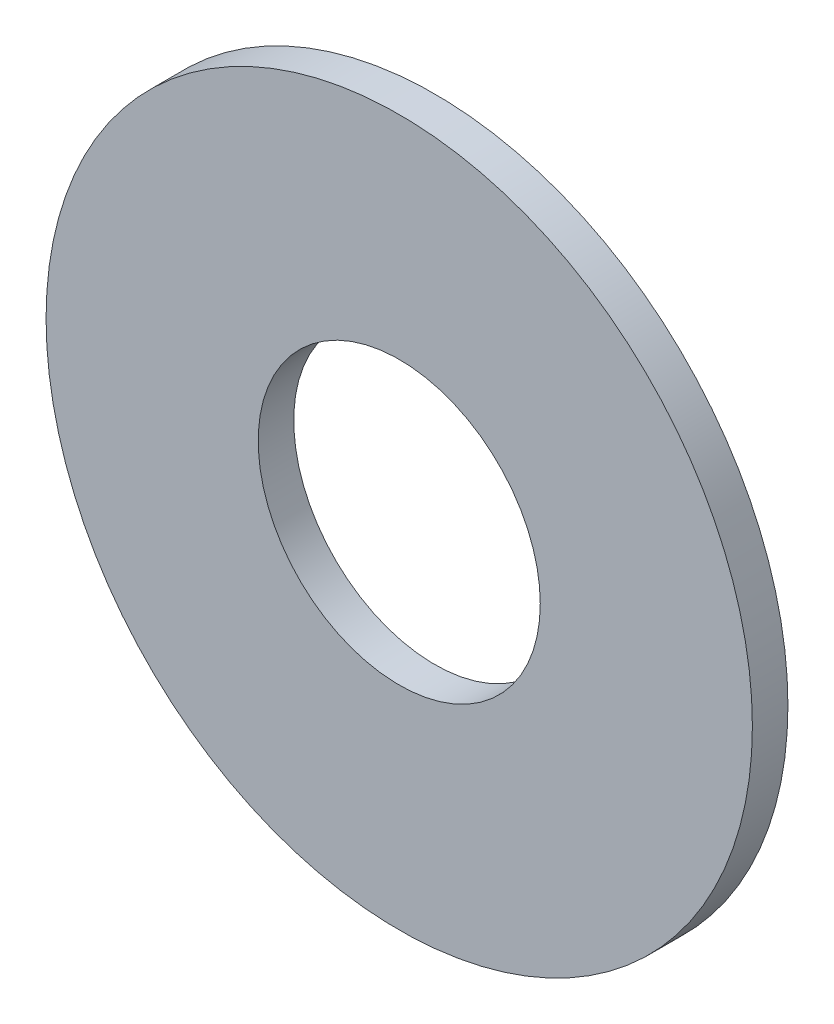
ISO-10303-21;
HEADER;
FILE_DESCRIPTION(('STEP AP214'),'2;1');
FILE_NAME('part.step','',(''),(''),'','','');
FILE_SCHEMA(('AUTOMOTIVE_DESIGN { 1 0 10303 214 1 1 1 1 }'));
ENDSEC;
DATA;
#1=APPLICATION_CONTEXT('core data for automotive mechanical design processes');
#2=APPLICATION_PROTOCOL_DEFINITION('international standard','automotive_design',2000,#1);
#3=PRODUCT_CONTEXT('',#1,'mechanical');
#4=PRODUCT('Part','Part','',(#3));
#5=PRODUCT_RELATED_PRODUCT_CATEGORY('part','',(#4));
#6=PRODUCT_DEFINITION_FORMATION('','',#4);
#7=PRODUCT_DEFINITION_CONTEXT('part definition',#1,'design');
#8=PRODUCT_DEFINITION('design','',#6,#7);
#9=PRODUCT_DEFINITION_SHAPE('','',#8);
#10=(LENGTH_UNIT() NAMED_UNIT(*) SI_UNIT(.MILLI.,.METRE.));
#11=(NAMED_UNIT(*) PLANE_ANGLE_UNIT() SI_UNIT($,.RADIAN.));
#12=(NAMED_UNIT(*) SI_UNIT($,.STERADIAN.) SOLID_ANGLE_UNIT());
#13=UNCERTAINTY_MEASURE_WITH_UNIT(LENGTH_MEASURE(1.E-05),#10,'distance_accuracy_value','');
#14=(GEOMETRIC_REPRESENTATION_CONTEXT(3) GLOBAL_UNCERTAINTY_ASSIGNED_CONTEXT((#13)) GLOBAL_UNIT_ASSIGNED_CONTEXT((#10,
#11,#12)) REPRESENTATION_CONTEXT('',''));
#15=CARTESIAN_POINT('',(0.,0.,0.));
#16=DIRECTION('',(0.,0.,1.));
#17=DIRECTION('',(1.,0.,0.));
#18=AXIS2_PLACEMENT_3D('',#15,#16,#17);
#19=CARTESIAN_POINT('',(0.,0.,0.4));
#20=DIRECTION('',(0.,0.,1.));
#21=DIRECTION('',(1.,0.,0.));
#22=AXIS2_PLACEMENT_3D('',#19,#20,#21);
#23=PLANE('',#22);
#24=CARTESIAN_POINT('',(0.,0.,0.4));
#25=DIRECTION('',(0.,0.,1.));
#26=DIRECTION('',(1.,0.,0.));
#27=AXIS2_PLACEMENT_3D('',#24,#25,#26);
#28=CIRCLE('',#27,3.975);
#29=CARTESIAN_POINT('',(3.975,0.,0.4));
#30=VERTEX_POINT('',#29);
#31=EDGE_CURVE('E10',#30,#30,#28,.T.);
#32=ORIENTED_EDGE('',*,*,#31,.T.);
#33=EDGE_LOOP('',(#32));
#34=FACE_BOUND('',#33,.T.);
#35=CARTESIAN_POINT('',(0.,0.,0.4));
#36=DIRECTION('',(0.,0.,1.));
#37=DIRECTION('',(1.,0.,0.));
#38=AXIS2_PLACEMENT_3D('',#35,#36,#37);
#39=CIRCLE('',#38,1.5875);
#40=CARTESIAN_POINT('',(1.5875,0.,0.4));
#41=VERTEX_POINT('',#40);
#42=EDGE_CURVE('E41',#41,#41,#39,.T.);
#43=ORIENTED_EDGE('',*,*,#42,.F.);
#44=EDGE_LOOP('',(#43));
#45=FACE_BOUND('',#44,.T.);
#46=ADVANCED_FACE('F30',(#34,#45),#23,.T.);
#47=CARTESIAN_POINT('',(0.,0.,0.));
#48=DIRECTION('',(0.,0.,1.));
#49=DIRECTION('',(1.,0.,0.));
#50=AXIS2_PLACEMENT_3D('',#47,#48,#49);
#51=PLANE('',#50);
#52=CARTESIAN_POINT('',(0.,0.,0.));
#53=DIRECTION('',(0.,0.,1.));
#54=DIRECTION('',(1.,0.,0.));
#55=AXIS2_PLACEMENT_3D('',#52,#53,#54);
#56=CIRCLE('',#55,3.975);
#57=CARTESIAN_POINT('',(3.975,0.,0.));
#58=VERTEX_POINT('',#57);
#59=EDGE_CURVE('E34',#58,#58,#56,.T.);
#60=ORIENTED_EDGE('',*,*,#59,.F.);
#61=EDGE_LOOP('',(#60));
#62=FACE_BOUND('',#61,.T.);
#63=CARTESIAN_POINT('',(0.,0.,0.));
#64=DIRECTION('',(0.,0.,1.));
#65=DIRECTION('',(1.,0.,0.));
#66=AXIS2_PLACEMENT_3D('',#63,#64,#65);
#67=CIRCLE('',#66,1.5875);
#68=CARTESIAN_POINT('',(1.5875,0.,0.));
#69=VERTEX_POINT('',#68);
#70=EDGE_CURVE('E43',#69,#69,#67,.T.);
#71=ORIENTED_EDGE('',*,*,#70,.T.);
#72=EDGE_LOOP('',(#71));
#73=FACE_BOUND('',#72,.T.);
#74=ADVANCED_FACE('F53',(#62,#73),#51,.F.);
#75=CARTESIAN_POINT('',(0.,0.,0.4));
#76=DIRECTION('',(0.,0.,-1.));
#77=DIRECTION('',(-1.,0.,0.));
#78=AXIS2_PLACEMENT_3D('',#75,#76,#77);
#79=CYLINDRICAL_SURFACE('',#78,3.975);
#80=ORIENTED_EDGE('',*,*,#31,.F.);
#81=EDGE_LOOP('',(#80));
#82=FACE_BOUND('',#81,.T.);
#83=ORIENTED_EDGE('',*,*,#59,.T.);
#84=EDGE_LOOP('',(#83));
#85=FACE_BOUND('',#84,.T.);
#86=ADVANCED_FACE('F32',(#82,#85),#79,.T.);
#87=CARTESIAN_POINT('',(0.,0.,0.4));
#88=DIRECTION('',(0.,0.,-1.));
#89=DIRECTION('',(-1.,0.,0.));
#90=AXIS2_PLACEMENT_3D('',#87,#88,#89);
#91=CYLINDRICAL_SURFACE('',#90,1.5875);
#92=ORIENTED_EDGE('',*,*,#42,.T.);
#93=EDGE_LOOP('',(#92));
#94=FACE_BOUND('',#93,.T.);
#95=ORIENTED_EDGE('',*,*,#70,.F.);
#96=EDGE_LOOP('',(#95));
#97=FACE_BOUND('',#96,.T.);
#98=ADVANCED_FACE('F49',(#94,#97),#91,.F.);
#99=CLOSED_SHELL('',(#46,#74,#86,#98));
#100=MANIFOLD_SOLID_BREP('B2',#99);
#101=ADVANCED_BREP_SHAPE_REPRESENTATION('',(#18,#100),#14);
#102=SHAPE_DEFINITION_REPRESENTATION(#9,#101);
ENDSEC;
END-ISO-10303-21;
